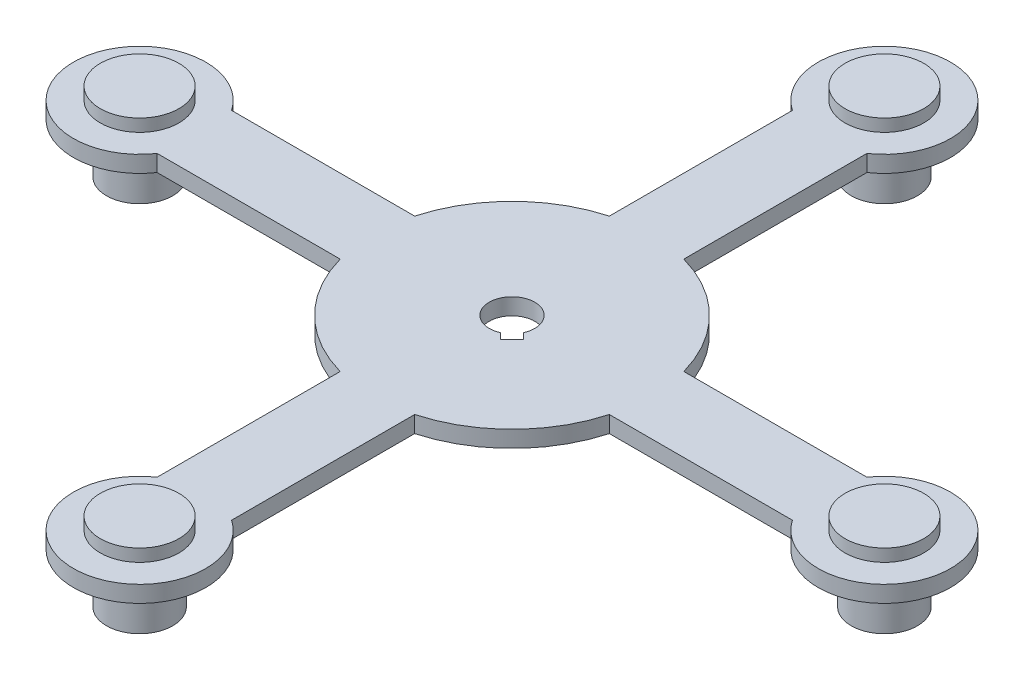
ISO-10303-21;
HEADER;
FILE_DESCRIPTION(('STEP AP214'),'2;1');
FILE_NAME('part.step','',(''),(''),'','','');
FILE_SCHEMA(('AUTOMOTIVE_DESIGN { 1 0 10303 214 1 1 1 1 }'));
ENDSEC;
DATA;
#1=APPLICATION_CONTEXT('core data for automotive mechanical design processes');
#2=APPLICATION_PROTOCOL_DEFINITION('international standard','automotive_design',2000,#1);
#3=PRODUCT_CONTEXT('',#1,'mechanical');
#4=PRODUCT('Part','Part','',(#3));
#5=PRODUCT_RELATED_PRODUCT_CATEGORY('part','',(#4));
#6=PRODUCT_DEFINITION_FORMATION('','',#4);
#7=PRODUCT_DEFINITION_CONTEXT('part definition',#1,'design');
#8=PRODUCT_DEFINITION('design','',#6,#7);
#9=PRODUCT_DEFINITION_SHAPE('','',#8);
#10=(LENGTH_UNIT() NAMED_UNIT(*) SI_UNIT(.MILLI.,.METRE.));
#11=(NAMED_UNIT(*) PLANE_ANGLE_UNIT() SI_UNIT($,.RADIAN.));
#12=(NAMED_UNIT(*) SI_UNIT($,.STERADIAN.) SOLID_ANGLE_UNIT());
#13=UNCERTAINTY_MEASURE_WITH_UNIT(LENGTH_MEASURE(1.E-05),#10,'distance_accuracy_value','');
#14=(GEOMETRIC_REPRESENTATION_CONTEXT(3) GLOBAL_UNCERTAINTY_ASSIGNED_CONTEXT((#13)) GLOBAL_UNIT_ASSIGNED_CONTEXT((#10,
#11,#12)) REPRESENTATION_CONTEXT('',''));
#15=CARTESIAN_POINT('',(0.,0.,0.));
#16=DIRECTION('',(0.,0.,1.));
#17=DIRECTION('',(1.,0.,0.));
#18=AXIS2_PLACEMENT_3D('',#15,#16,#17);
#19=CARTESIAN_POINT('',(-180.,4.,0.));
#20=DIRECTION('',(0.,-1.,0.));
#21=DIRECTION('',(0.,0.,-1.));
#22=AXIS2_PLACEMENT_3D('',#19,#20,#21);
#23=CYLINDRICAL_SURFACE('',#22,32.);
#24=CARTESIAN_POINT('',(-180.,-4.,0.));
#25=DIRECTION('',(0.,1.,0.));
#26=DIRECTION('',(0.,0.,1.));
#27=AXIS2_PLACEMENT_3D('',#24,#25,#26);
#28=CIRCLE('',#27,32.);
#29=CARTESIAN_POINT('',(-153.542486889354,-4.,-18.));
#30=VERTEX_POINT('',#29);
#31=CARTESIAN_POINT('',(-153.542486889354,-4.,18.));
#32=VERTEX_POINT('',#31);
#33=EDGE_CURVE('E249',#30,#32,#28,.T.);
#34=ORIENTED_EDGE('',*,*,#33,.T.);
#35=DIRECTION('',(0.,-1.,0.));
#36=VECTOR('',#35,1.);
#37=CARTESIAN_POINT('',(-153.542486889354,4.,18.));
#38=LINE('',#37,#36);
#39=CARTESIAN_POINT('',(-153.542486889354,4.,18.));
#40=VERTEX_POINT('',#39);
#41=EDGE_CURVE('E41',#40,#32,#38,.T.);
#42=ORIENTED_EDGE('',*,*,#41,.F.);
#43=CARTESIAN_POINT('',(-180.,4.,0.));
#44=DIRECTION('',(0.,1.,0.));
#45=DIRECTION('',(0.,0.,1.));
#46=AXIS2_PLACEMENT_3D('',#43,#44,#45);
#47=CIRCLE('',#46,32.);
#48=CARTESIAN_POINT('',(-153.542486889354,4.,-18.));
#49=VERTEX_POINT('',#48);
#50=EDGE_CURVE('E252',#49,#40,#47,.T.);
#51=ORIENTED_EDGE('',*,*,#50,.F.);
#52=DIRECTION('',(0.,-1.,0.));
#53=VECTOR('',#52,1.);
#54=CARTESIAN_POINT('',(-153.542486889354,4.,-18.));
#55=LINE('',#54,#53);
#56=EDGE_CURVE('E290',#49,#30,#55,.T.);
#57=ORIENTED_EDGE('',*,*,#56,.T.);
#58=EDGE_LOOP('',(#34,#42,#51,#57));
#59=FACE_BOUND('',#58,.T.);
#60=ADVANCED_FACE('F38',(#59),#23,.T.);
#61=CARTESIAN_POINT('',(0.,4.,18.));
#62=DIRECTION('',(0.,0.,-1.));
#63=DIRECTION('',(-1.,0.,0.));
#64=AXIS2_PLACEMENT_3D('',#61,#62,#63);
#65=PLANE('',#64);
#66=DIRECTION('',(1.,0.,0.));
#67=VECTOR('',#66,1.);
#68=CARTESIAN_POINT('',(0.,-4.,18.));
#69=LINE('',#68,#67);
#70=CARTESIAN_POINT('',(-65.0557453266043,-4.,18.));
#71=VERTEX_POINT('',#70);
#72=EDGE_CURVE('E293',#32,#71,#69,.T.);
#73=ORIENTED_EDGE('',*,*,#72,.T.);
#74=DIRECTION('',(0.,-1.,0.));
#75=VECTOR('',#74,1.);
#76=CARTESIAN_POINT('',(-65.0557453266043,4.,18.));
#77=LINE('',#76,#75);
#78=CARTESIAN_POINT('',(-65.0557453266043,4.,18.));
#79=VERTEX_POINT('',#78);
#80=EDGE_CURVE('E362',#79,#71,#77,.T.);
#81=ORIENTED_EDGE('',*,*,#80,.F.);
#82=DIRECTION('',(1.,0.,0.));
#83=VECTOR('',#82,1.);
#84=CARTESIAN_POINT('',(0.,4.,18.));
#85=LINE('',#84,#83);
#86=EDGE_CURVE('E255',#40,#79,#85,.T.);
#87=ORIENTED_EDGE('',*,*,#86,.F.);
#88=ORIENTED_EDGE('',*,*,#41,.T.);
#89=EDGE_LOOP('',(#73,#81,#87,#88));
#90=FACE_BOUND('',#89,.T.);
#91=ADVANCED_FACE('F371',(#90),#65,.F.);
#92=CARTESIAN_POINT('',(0.,4.,0.));
#93=DIRECTION('',(0.,-1.,0.));
#94=DIRECTION('',(0.,0.,-1.));
#95=AXIS2_PLACEMENT_3D('',#92,#93,#94);
#96=CYLINDRICAL_SURFACE('',#95,67.5);
#97=CARTESIAN_POINT('',(0.,-4.,0.));
#98=DIRECTION('',(0.,1.,0.));
#99=DIRECTION('',(0.,0.,1.));
#100=AXIS2_PLACEMENT_3D('',#97,#98,#99);
#101=CIRCLE('',#100,67.5);
#102=CARTESIAN_POINT('',(-18.,-4.,65.0557453266043));
#103=VERTEX_POINT('',#102);
#104=EDGE_CURVE('E295',#71,#103,#101,.T.);
#105=ORIENTED_EDGE('',*,*,#104,.T.);
#106=DIRECTION('',(0.,-1.,0.));
#107=VECTOR('',#106,1.);
#108=CARTESIAN_POINT('',(-18.,4.,65.0557453266043));
#109=LINE('',#108,#107);
#110=CARTESIAN_POINT('',(-18.,4.,65.0557453266043));
#111=VERTEX_POINT('',#110);
#112=EDGE_CURVE('E361',#111,#103,#109,.T.);
#113=ORIENTED_EDGE('',*,*,#112,.F.);
#114=CARTESIAN_POINT('',(0.,4.,0.));
#115=DIRECTION('',(0.,1.,0.));
#116=DIRECTION('',(0.,0.,1.));
#117=AXIS2_PLACEMENT_3D('',#114,#115,#116);
#118=CIRCLE('',#117,67.5);
#119=EDGE_CURVE('E258',#79,#111,#118,.T.);
#120=ORIENTED_EDGE('',*,*,#119,.F.);
#121=ORIENTED_EDGE('',*,*,#80,.T.);
#122=EDGE_LOOP('',(#105,#113,#120,#121));
#123=FACE_BOUND('',#122,.T.);
#124=ADVANCED_FACE('F439',(#123),#96,.T.);
#125=CARTESIAN_POINT('',(-18.,4.,0.));
#126=DIRECTION('',(-1.,0.,0.));
#127=DIRECTION('',(0.,0.,1.));
#128=AXIS2_PLACEMENT_3D('',#125,#126,#127);
#129=PLANE('',#128);
#130=DIRECTION('',(0.,0.,-1.));
#131=VECTOR('',#130,1.);
#132=CARTESIAN_POINT('',(-18.,-4.,0.));
#133=LINE('',#132,#131);
#134=CARTESIAN_POINT('',(-18.,-4.,153.542486889354));
#135=VERTEX_POINT('',#134);
#136=EDGE_CURVE('E298',#135,#103,#133,.T.);
#137=ORIENTED_EDGE('',*,*,#136,.F.);
#138=DIRECTION('',(0.,-1.,0.));
#139=VECTOR('',#138,1.);
#140=CARTESIAN_POINT('',(-18.,4.,153.542486889354));
#141=LINE('',#140,#139);
#142=CARTESIAN_POINT('',(-18.,4.,153.542486889354));
#143=VERTEX_POINT('',#142);
#144=EDGE_CURVE('E359',#143,#135,#141,.T.);
#145=ORIENTED_EDGE('',*,*,#144,.F.);
#146=DIRECTION('',(0.,0.,-1.));
#147=VECTOR('',#146,1.);
#148=CARTESIAN_POINT('',(-18.,4.,0.));
#149=LINE('',#148,#147);
#150=EDGE_CURVE('E260',#143,#111,#149,.T.);
#151=ORIENTED_EDGE('',*,*,#150,.T.);
#152=ORIENTED_EDGE('',*,*,#112,.T.);
#153=EDGE_LOOP('',(#137,#145,#151,#152));
#154=FACE_BOUND('',#153,.T.);
#155=ADVANCED_FACE('F437',(#154),#129,.T.);
#156=CARTESIAN_POINT('',(0.,4.,180.));
#157=DIRECTION('',(0.,-1.,0.));
#158=DIRECTION('',(0.,0.,-1.));
#159=AXIS2_PLACEMENT_3D('',#156,#157,#158);
#160=CYLINDRICAL_SURFACE('',#159,32.);
#161=CARTESIAN_POINT('',(0.,-4.,180.));
#162=DIRECTION('',(0.,1.,0.));
#163=DIRECTION('',(0.,0.,1.));
#164=AXIS2_PLACEMENT_3D('',#161,#162,#163);
#165=CIRCLE('',#164,32.);
#166=CARTESIAN_POINT('',(18.,-4.,153.542486889354));
#167=VERTEX_POINT('',#166);
#168=EDGE_CURVE('E301',#135,#167,#165,.T.);
#169=ORIENTED_EDGE('',*,*,#168,.T.);
#170=DIRECTION('',(0.,-1.,0.));
#171=VECTOR('',#170,1.);
#172=CARTESIAN_POINT('',(18.,4.,153.542486889354));
#173=LINE('',#172,#171);
#174=CARTESIAN_POINT('',(18.,4.,153.542486889354));
#175=VERTEX_POINT('',#174);
#176=EDGE_CURVE('E356',#175,#167,#173,.T.);
#177=ORIENTED_EDGE('',*,*,#176,.F.);
#178=CARTESIAN_POINT('',(0.,4.,180.));
#179=DIRECTION('',(0.,1.,0.));
#180=DIRECTION('',(0.,0.,1.));
#181=AXIS2_PLACEMENT_3D('',#178,#179,#180);
#182=CIRCLE('',#181,32.);
#183=EDGE_CURVE('E263',#143,#175,#182,.T.);
#184=ORIENTED_EDGE('',*,*,#183,.F.);
#185=ORIENTED_EDGE('',*,*,#144,.T.);
#186=EDGE_LOOP('',(#169,#177,#184,#185));
#187=FACE_BOUND('',#186,.T.);
#188=ADVANCED_FACE('F434',(#187),#160,.T.);
#189=CARTESIAN_POINT('',(18.,4.,0.));
#190=DIRECTION('',(-1.,0.,0.));
#191=DIRECTION('',(0.,0.,1.));
#192=AXIS2_PLACEMENT_3D('',#189,#190,#191);
#193=PLANE('',#192);
#194=DIRECTION('',(0.,0.,-1.));
#195=VECTOR('',#194,1.);
#196=CARTESIAN_POINT('',(18.,-4.,0.));
#197=LINE('',#196,#195);
#198=CARTESIAN_POINT('',(18.,-4.,65.0557453266043));
#199=VERTEX_POINT('',#198);
#200=EDGE_CURVE('E303',#167,#199,#197,.T.);
#201=ORIENTED_EDGE('',*,*,#200,.T.);
#202=DIRECTION('',(0.,-1.,0.));
#203=VECTOR('',#202,1.);
#204=CARTESIAN_POINT('',(18.,4.,65.0557453266043));
#205=LINE('',#204,#203);
#206=CARTESIAN_POINT('',(18.,4.,65.0557453266043));
#207=VERTEX_POINT('',#206);
#208=EDGE_CURVE('E353',#207,#199,#205,.T.);
#209=ORIENTED_EDGE('',*,*,#208,.F.);
#210=DIRECTION('',(0.,0.,-1.));
#211=VECTOR('',#210,1.);
#212=CARTESIAN_POINT('',(18.,4.,0.));
#213=LINE('',#212,#211);
#214=EDGE_CURVE('E265',#175,#207,#213,.T.);
#215=ORIENTED_EDGE('',*,*,#214,.F.);
#216=ORIENTED_EDGE('',*,*,#176,.T.);
#217=EDGE_LOOP('',(#201,#209,#215,#216));
#218=FACE_BOUND('',#217,.T.);
#219=ADVANCED_FACE('F429',(#218),#193,.F.);
#220=CARTESIAN_POINT('',(0.,4.,0.));
#221=DIRECTION('',(0.,-1.,0.));
#222=DIRECTION('',(0.,0.,-1.));
#223=AXIS2_PLACEMENT_3D('',#220,#221,#222);
#224=CYLINDRICAL_SURFACE('',#223,67.5);
#225=CARTESIAN_POINT('',(0.,-4.,0.));
#226=DIRECTION('',(0.,1.,0.));
#227=DIRECTION('',(0.,0.,1.));
#228=AXIS2_PLACEMENT_3D('',#225,#226,#227);
#229=CIRCLE('',#228,67.5);
#230=CARTESIAN_POINT('',(65.0557453266044,-4.,18.));
#231=VERTEX_POINT('',#230);
#232=EDGE_CURVE('E305',#199,#231,#229,.T.);
#233=ORIENTED_EDGE('',*,*,#232,.T.);
#234=DIRECTION('',(0.,-1.,0.));
#235=VECTOR('',#234,1.);
#236=CARTESIAN_POINT('',(65.0557453266044,4.,18.));
#237=LINE('',#236,#235);
#238=CARTESIAN_POINT('',(65.0557453266044,4.,18.));
#239=VERTEX_POINT('',#238);
#240=EDGE_CURVE('E350',#239,#231,#237,.T.);
#241=ORIENTED_EDGE('',*,*,#240,.F.);
#242=CARTESIAN_POINT('',(0.,4.,0.));
#243=DIRECTION('',(0.,1.,0.));
#244=DIRECTION('',(0.,0.,1.));
#245=AXIS2_PLACEMENT_3D('',#242,#243,#244);
#246=CIRCLE('',#245,67.5);
#247=EDGE_CURVE('E267',#207,#239,#246,.T.);
#248=ORIENTED_EDGE('',*,*,#247,.F.);
#249=ORIENTED_EDGE('',*,*,#208,.T.);
#250=EDGE_LOOP('',(#233,#241,#248,#249));
#251=FACE_BOUND('',#250,.T.);
#252=ADVANCED_FACE('F423',(#251),#224,.T.);
#253=CARTESIAN_POINT('',(0.,4.,18.));
#254=DIRECTION('',(0.,0.,-1.));
#255=DIRECTION('',(-1.,0.,0.));
#256=AXIS2_PLACEMENT_3D('',#253,#254,#255);
#257=PLANE('',#256);
#258=DIRECTION('',(1.,0.,0.));
#259=VECTOR('',#258,1.);
#260=CARTESIAN_POINT('',(0.,-4.,18.));
#261=LINE('',#260,#259);
#262=CARTESIAN_POINT('',(153.542486889354,-4.,18.));
#263=VERTEX_POINT('',#262);
#264=EDGE_CURVE('E307',#231,#263,#261,.T.);
#265=ORIENTED_EDGE('',*,*,#264,.T.);
#266=DIRECTION('',(0.,-1.,0.));
#267=VECTOR('',#266,1.);
#268=CARTESIAN_POINT('',(153.542486889354,4.,18.));
#269=LINE('',#268,#267);
#270=CARTESIAN_POINT('',(153.542486889354,4.,18.));
#271=VERTEX_POINT('',#270);
#272=EDGE_CURVE('E347',#271,#263,#269,.T.);
#273=ORIENTED_EDGE('',*,*,#272,.F.);
#274=DIRECTION('',(1.,0.,0.));
#275=VECTOR('',#274,1.);
#276=CARTESIAN_POINT('',(0.,4.,18.));
#277=LINE('',#276,#275);
#278=EDGE_CURVE('E269',#239,#271,#277,.T.);
#279=ORIENTED_EDGE('',*,*,#278,.F.);
#280=ORIENTED_EDGE('',*,*,#240,.T.);
#281=EDGE_LOOP('',(#265,#273,#279,#280));
#282=FACE_BOUND('',#281,.T.);
#283=ADVANCED_FACE('F419',(#282),#257,.F.);
#284=CARTESIAN_POINT('',(180.,4.,0.));
#285=DIRECTION('',(0.,-1.,0.));
#286=DIRECTION('',(0.,0.,-1.));
#287=AXIS2_PLACEMENT_3D('',#284,#285,#286);
#288=CYLINDRICAL_SURFACE('',#287,32.);
#289=CARTESIAN_POINT('',(180.,-4.,0.));
#290=DIRECTION('',(0.,1.,0.));
#291=DIRECTION('',(0.,0.,1.));
#292=AXIS2_PLACEMENT_3D('',#289,#290,#291);
#293=CIRCLE('',#292,32.);
#294=CARTESIAN_POINT('',(153.542486889354,-4.,-18.));
#295=VERTEX_POINT('',#294);
#296=EDGE_CURVE('E309',#263,#295,#293,.T.);
#297=ORIENTED_EDGE('',*,*,#296,.T.);
#298=DIRECTION('',(0.,-1.,0.));
#299=VECTOR('',#298,1.);
#300=CARTESIAN_POINT('',(153.542486889354,4.,-18.));
#301=LINE('',#300,#299);
#302=CARTESIAN_POINT('',(153.542486889354,4.,-18.));
#303=VERTEX_POINT('',#302);
#304=EDGE_CURVE('E345',#303,#295,#301,.T.);
#305=ORIENTED_EDGE('',*,*,#304,.F.);
#306=CARTESIAN_POINT('',(180.,4.,0.));
#307=DIRECTION('',(0.,1.,0.));
#308=DIRECTION('',(0.,0.,1.));
#309=AXIS2_PLACEMENT_3D('',#306,#307,#308);
#310=CIRCLE('',#309,32.);
#311=EDGE_CURVE('E271',#271,#303,#310,.T.);
#312=ORIENTED_EDGE('',*,*,#311,.F.);
#313=ORIENTED_EDGE('',*,*,#272,.T.);
#314=EDGE_LOOP('',(#297,#305,#312,#313));
#315=FACE_BOUND('',#314,.T.);
#316=ADVANCED_FACE('F414',(#315),#288,.T.);
#317=CARTESIAN_POINT('',(0.,4.,-18.));
#318=DIRECTION('',(0.,0.,-1.));
#319=DIRECTION('',(-1.,0.,0.));
#320=AXIS2_PLACEMENT_3D('',#317,#318,#319);
#321=PLANE('',#320);
#322=DIRECTION('',(1.,0.,0.));
#323=VECTOR('',#322,1.);
#324=CARTESIAN_POINT('',(0.,-4.,-18.));
#325=LINE('',#324,#323);
#326=CARTESIAN_POINT('',(65.0557453266044,-4.,-18.));
#327=VERTEX_POINT('',#326);
#328=EDGE_CURVE('E312',#327,#295,#325,.T.);
#329=ORIENTED_EDGE('',*,*,#328,.F.);
#330=DIRECTION('',(0.,-1.,0.));
#331=VECTOR('',#330,1.);
#332=CARTESIAN_POINT('',(65.0557453266044,4.,-18.));
#333=LINE('',#332,#331);
#334=CARTESIAN_POINT('',(65.0557453266044,4.,-18.));
#335=VERTEX_POINT('',#334);
#336=EDGE_CURVE('E343',#335,#327,#333,.T.);
#337=ORIENTED_EDGE('',*,*,#336,.F.);
#338=DIRECTION('',(1.,0.,0.));
#339=VECTOR('',#338,1.);
#340=CARTESIAN_POINT('',(0.,4.,-18.));
#341=LINE('',#340,#339);
#342=EDGE_CURVE('E273',#335,#303,#341,.T.);
#343=ORIENTED_EDGE('',*,*,#342,.T.);
#344=ORIENTED_EDGE('',*,*,#304,.T.);
#345=EDGE_LOOP('',(#329,#337,#343,#344));
#346=FACE_BOUND('',#345,.T.);
#347=ADVANCED_FACE('F408',(#346),#321,.T.);
#348=CARTESIAN_POINT('',(0.,4.,0.));
#349=DIRECTION('',(0.,-1.,0.));
#350=DIRECTION('',(0.,0.,-1.));
#351=AXIS2_PLACEMENT_3D('',#348,#349,#350);
#352=CYLINDRICAL_SURFACE('',#351,67.5);
#353=CARTESIAN_POINT('',(0.,-4.,0.));
#354=DIRECTION('',(0.,1.,0.));
#355=DIRECTION('',(0.,0.,1.));
#356=AXIS2_PLACEMENT_3D('',#353,#354,#355);
#357=CIRCLE('',#356,67.5);
#358=CARTESIAN_POINT('',(18.,-4.,-65.0557453266044));
#359=VERTEX_POINT('',#358);
#360=EDGE_CURVE('E315',#327,#359,#357,.T.);
#361=ORIENTED_EDGE('',*,*,#360,.T.);
#362=DIRECTION('',(0.,-1.,0.));
#363=VECTOR('',#362,1.);
#364=CARTESIAN_POINT('',(18.,4.,-65.0557453266044));
#365=LINE('',#364,#363);
#366=CARTESIAN_POINT('',(18.,4.,-65.0557453266044));
#367=VERTEX_POINT('',#366);
#368=EDGE_CURVE('E340',#367,#359,#365,.T.);
#369=ORIENTED_EDGE('',*,*,#368,.F.);
#370=CARTESIAN_POINT('',(0.,4.,0.));
#371=DIRECTION('',(0.,1.,0.));
#372=DIRECTION('',(0.,0.,1.));
#373=AXIS2_PLACEMENT_3D('',#370,#371,#372);
#374=CIRCLE('',#373,67.5);
#375=EDGE_CURVE('E276',#335,#367,#374,.T.);
#376=ORIENTED_EDGE('',*,*,#375,.F.);
#377=ORIENTED_EDGE('',*,*,#336,.T.);
#378=EDGE_LOOP('',(#361,#369,#376,#377));
#379=FACE_BOUND('',#378,.T.);
#380=ADVANCED_FACE('F405',(#379),#352,.T.);
#381=CARTESIAN_POINT('',(18.,4.,0.));
#382=DIRECTION('',(-1.,0.,0.));
#383=DIRECTION('',(0.,0.,1.));
#384=AXIS2_PLACEMENT_3D('',#381,#382,#383);
#385=PLANE('',#384);
#386=DIRECTION('',(0.,0.,-1.));
#387=VECTOR('',#386,1.);
#388=CARTESIAN_POINT('',(18.,-4.,0.));
#389=LINE('',#388,#387);
#390=CARTESIAN_POINT('',(18.,-4.,-153.542486889354));
#391=VERTEX_POINT('',#390);
#392=EDGE_CURVE('E317',#359,#391,#389,.T.);
#393=ORIENTED_EDGE('',*,*,#392,.T.);
#394=DIRECTION('',(0.,-1.,0.));
#395=VECTOR('',#394,1.);
#396=CARTESIAN_POINT('',(18.,4.,-153.542486889354));
#397=LINE('',#396,#395);
#398=CARTESIAN_POINT('',(18.,4.,-153.542486889354));
#399=VERTEX_POINT('',#398);
#400=EDGE_CURVE('E337',#399,#391,#397,.T.);
#401=ORIENTED_EDGE('',*,*,#400,.F.);
#402=DIRECTION('',(0.,0.,-1.));
#403=VECTOR('',#402,1.);
#404=CARTESIAN_POINT('',(18.,4.,0.));
#405=LINE('',#404,#403);
#406=EDGE_CURVE('E278',#367,#399,#405,.T.);
#407=ORIENTED_EDGE('',*,*,#406,.F.);
#408=ORIENTED_EDGE('',*,*,#368,.T.);
#409=EDGE_LOOP('',(#393,#401,#407,#408));
#410=FACE_BOUND('',#409,.T.);
#411=ADVANCED_FACE('F400',(#410),#385,.F.);
#412=CARTESIAN_POINT('',(0.,4.,-180.));
#413=DIRECTION('',(0.,-1.,0.));
#414=DIRECTION('',(0.,0.,-1.));
#415=AXIS2_PLACEMENT_3D('',#412,#413,#414);
#416=CYLINDRICAL_SURFACE('',#415,32.);
#417=CARTESIAN_POINT('',(0.,-4.,-180.));
#418=DIRECTION('',(0.,1.,0.));
#419=DIRECTION('',(0.,0.,1.));
#420=AXIS2_PLACEMENT_3D('',#417,#418,#419);
#421=CIRCLE('',#420,32.);
#422=CARTESIAN_POINT('',(-18.,-4.,-153.542486889354));
#423=VERTEX_POINT('',#422);
#424=EDGE_CURVE('E319',#391,#423,#421,.T.);
#425=ORIENTED_EDGE('',*,*,#424,.T.);
#426=DIRECTION('',(0.,-1.,0.));
#427=VECTOR('',#426,1.);
#428=CARTESIAN_POINT('',(-18.,4.,-153.542486889354));
#429=LINE('',#428,#427);
#430=CARTESIAN_POINT('',(-18.,4.,-153.542486889354));
#431=VERTEX_POINT('',#430);
#432=EDGE_CURVE('E335',#431,#423,#429,.T.);
#433=ORIENTED_EDGE('',*,*,#432,.F.);
#434=CARTESIAN_POINT('',(0.,4.,-180.));
#435=DIRECTION('',(0.,1.,0.));
#436=DIRECTION('',(0.,0.,1.));
#437=AXIS2_PLACEMENT_3D('',#434,#435,#436);
#438=CIRCLE('',#437,32.);
#439=EDGE_CURVE('E280',#399,#431,#438,.T.);
#440=ORIENTED_EDGE('',*,*,#439,.F.);
#441=ORIENTED_EDGE('',*,*,#400,.T.);
#442=EDGE_LOOP('',(#425,#433,#440,#441));
#443=FACE_BOUND('',#442,.T.);
#444=ADVANCED_FACE('F394',(#443),#416,.T.);
#445=CARTESIAN_POINT('',(-18.,4.,0.));
#446=DIRECTION('',(-1.,0.,0.));
#447=DIRECTION('',(0.,0.,1.));
#448=AXIS2_PLACEMENT_3D('',#445,#446,#447);
#449=PLANE('',#448);
#450=DIRECTION('',(0.,0.,-1.));
#451=VECTOR('',#450,1.);
#452=CARTESIAN_POINT('',(-18.,-4.,0.));
#453=LINE('',#452,#451);
#454=CARTESIAN_POINT('',(-18.,-4.,-65.0557453266043));
#455=VERTEX_POINT('',#454);
#456=EDGE_CURVE('E322',#455,#423,#453,.T.);
#457=ORIENTED_EDGE('',*,*,#456,.F.);
#458=DIRECTION('',(0.,-1.,0.));
#459=VECTOR('',#458,1.);
#460=CARTESIAN_POINT('',(-18.,4.,-65.0557453266043));
#461=LINE('',#460,#459);
#462=CARTESIAN_POINT('',(-18.,4.,-65.0557453266043));
#463=VERTEX_POINT('',#462);
#464=EDGE_CURVE('E333',#463,#455,#461,.T.);
#465=ORIENTED_EDGE('',*,*,#464,.F.);
#466=DIRECTION('',(0.,0.,-1.));
#467=VECTOR('',#466,1.);
#468=CARTESIAN_POINT('',(-18.,4.,0.));
#469=LINE('',#468,#467);
#470=EDGE_CURVE('E282',#463,#431,#469,.T.);
#471=ORIENTED_EDGE('',*,*,#470,.T.);
#472=ORIENTED_EDGE('',*,*,#432,.T.);
#473=EDGE_LOOP('',(#457,#465,#471,#472));
#474=FACE_BOUND('',#473,.T.);
#475=ADVANCED_FACE('F389',(#474),#449,.T.);
#476=CARTESIAN_POINT('',(0.,4.,0.));
#477=DIRECTION('',(0.,-1.,0.));
#478=DIRECTION('',(0.,0.,-1.));
#479=AXIS2_PLACEMENT_3D('',#476,#477,#478);
#480=CYLINDRICAL_SURFACE('',#479,67.5);
#481=CARTESIAN_POINT('',(0.,-4.,0.));
#482=DIRECTION('',(0.,1.,0.));
#483=DIRECTION('',(0.,0.,1.));
#484=AXIS2_PLACEMENT_3D('',#481,#482,#483);
#485=CIRCLE('',#484,67.5);
#486=CARTESIAN_POINT('',(-65.0557453266043,-4.,-18.));
#487=VERTEX_POINT('',#486);
#488=EDGE_CURVE('E325',#455,#487,#485,.T.);
#489=ORIENTED_EDGE('',*,*,#488,.T.);
#490=DIRECTION('',(0.,-1.,0.));
#491=VECTOR('',#490,1.);
#492=CARTESIAN_POINT('',(-65.0557453266043,4.,-18.));
#493=LINE('',#492,#491);
#494=CARTESIAN_POINT('',(-65.0557453266043,4.,-18.));
#495=VERTEX_POINT('',#494);
#496=EDGE_CURVE('E331',#495,#487,#493,.T.);
#497=ORIENTED_EDGE('',*,*,#496,.F.);
#498=CARTESIAN_POINT('',(0.,4.,0.));
#499=DIRECTION('',(0.,1.,0.));
#500=DIRECTION('',(0.,0.,1.));
#501=AXIS2_PLACEMENT_3D('',#498,#499,#500);
#502=CIRCLE('',#501,67.5);
#503=EDGE_CURVE('E285',#463,#495,#502,.T.);
#504=ORIENTED_EDGE('',*,*,#503,.F.);
#505=ORIENTED_EDGE('',*,*,#464,.T.);
#506=EDGE_LOOP('',(#489,#497,#504,#505));
#507=FACE_BOUND('',#506,.T.);
#508=ADVANCED_FACE('F385',(#507),#480,.T.);
#509=CARTESIAN_POINT('',(0.,4.,-18.));
#510=DIRECTION('',(0.,0.,-1.));
#511=DIRECTION('',(-1.,0.,0.));
#512=AXIS2_PLACEMENT_3D('',#509,#510,#511);
#513=PLANE('',#512);
#514=DIRECTION('',(1.,0.,0.));
#515=VECTOR('',#514,1.);
#516=CARTESIAN_POINT('',(0.,-4.,-18.));
#517=LINE('',#516,#515);
#518=EDGE_CURVE('E256',#30,#487,#517,.T.);
#519=ORIENTED_EDGE('',*,*,#518,.F.);
#520=ORIENTED_EDGE('',*,*,#56,.F.);
#521=DIRECTION('',(1.,0.,0.));
#522=VECTOR('',#521,1.);
#523=CARTESIAN_POINT('',(0.,4.,-18.));
#524=LINE('',#523,#522);
#525=EDGE_CURVE('E287',#49,#495,#524,.T.);
#526=ORIENTED_EDGE('',*,*,#525,.T.);
#527=ORIENTED_EDGE('',*,*,#496,.T.);
#528=EDGE_LOOP('',(#519,#520,#526,#527));
#529=FACE_BOUND('',#528,.T.);
#530=ADVANCED_FACE('F380',(#529),#513,.T.);
#531=CARTESIAN_POINT('',(0.,4.,0.));
#532=DIRECTION('',(0.,1.,0.));
#533=DIRECTION('',(0.,0.,1.));
#534=AXIS2_PLACEMENT_3D('',#531,#532,#533);
#535=PLANE('',#534);
#536=CARTESIAN_POINT('',(0.,4.,0.));
#537=DIRECTION('',(0.,1.,0.));
#538=DIRECTION('',(0.,0.,1.));
#539=AXIS2_PLACEMENT_3D('',#536,#537,#538);
#540=CIRCLE('',#539,11.);
#541=CARTESIAN_POINT('',(10.0741154978409,4.,4.41726124834851));
#542=VERTEX_POINT('',#541);
#543=CARTESIAN_POINT('',(4.41726124834855,4.,10.0741154978409));
#544=VERTEX_POINT('',#543);
#545=EDGE_CURVE('E53',#542,#544,#540,.T.);
#546=ORIENTED_EDGE('',*,*,#545,.F.);
#547=DIRECTION('',(0.707106781186549,0.,0.707106781186546));
#548=VECTOR('',#547,1.);
#549=CARTESIAN_POINT('',(2.82842712474619,4.,-2.8284271247462));
#550=LINE('',#549,#548);
#551=CARTESIAN_POINT('',(12.9400540957138,4.,7.28319984622142));
#552=VERTEX_POINT('',#551);
#553=EDGE_CURVE('E194',#542,#552,#550,.T.);
#554=ORIENTED_EDGE('',*,*,#553,.T.);
#555=DIRECTION('',(0.707106781186546,0.,-0.707106781186549));
#556=VECTOR('',#555,1.);
#557=CARTESIAN_POINT('',(10.1116269709677,4.,10.1116269709676));
#558=LINE('',#557,#556);
#559=CARTESIAN_POINT('',(7.28319984622146,4.,12.9400540957138));
#560=VERTEX_POINT('',#559);
#561=EDGE_CURVE('E178',#560,#552,#558,.T.);
#562=ORIENTED_EDGE('',*,*,#561,.F.);
#563=DIRECTION('',(0.707106781186549,0.,0.707106781186547));
#564=VECTOR('',#563,1.);
#565=CARTESIAN_POINT('',(-2.82842712474618,4.,2.82842712474619));
#566=LINE('',#565,#564);
#567=EDGE_CURVE('E187',#544,#560,#566,.T.);
#568=ORIENTED_EDGE('',*,*,#567,.F.);
#569=EDGE_LOOP('',(#546,#554,#562,#568));
#570=FACE_BOUND('',#569,.T.);
#571=CARTESIAN_POINT('',(0.,4.,180.));
#572=DIRECTION('',(0.,1.,0.));
#573=DIRECTION('',(0.,0.,1.));
#574=AXIS2_PLACEMENT_3D('',#571,#572,#573);
#575=CIRCLE('',#574,19.);
#576=CARTESIAN_POINT('',(0.,4.,199.));
#577=VERTEX_POINT('',#576);
#578=EDGE_CURVE('E205',#577,#577,#575,.T.);
#579=ORIENTED_EDGE('',*,*,#578,.F.);
#580=EDGE_LOOP('',(#579));
#581=FACE_BOUND('',#580,.T.);
#582=CARTESIAN_POINT('',(180.,4.,0.));
#583=DIRECTION('',(0.,1.,0.));
#584=DIRECTION('',(0.,0.,1.));
#585=AXIS2_PLACEMENT_3D('',#582,#583,#584);
#586=CIRCLE('',#585,19.);
#587=CARTESIAN_POINT('',(180.,4.,19.));
#588=VERTEX_POINT('',#587);
#589=EDGE_CURVE('E210',#588,#588,#586,.T.);
#590=ORIENTED_EDGE('',*,*,#589,.F.);
#591=EDGE_LOOP('',(#590));
#592=FACE_BOUND('',#591,.T.);
#593=CARTESIAN_POINT('',(0.,4.,-180.));
#594=DIRECTION('',(0.,1.,0.));
#595=DIRECTION('',(0.,0.,1.));
#596=AXIS2_PLACEMENT_3D('',#593,#594,#595);
#597=CIRCLE('',#596,19.);
#598=CARTESIAN_POINT('',(0.,4.,-161.));
#599=VERTEX_POINT('',#598);
#600=EDGE_CURVE('E216',#599,#599,#597,.T.);
#601=ORIENTED_EDGE('',*,*,#600,.F.);
#602=EDGE_LOOP('',(#601));
#603=FACE_BOUND('',#602,.T.);
#604=CARTESIAN_POINT('',(-180.,4.,0.));
#605=DIRECTION('',(0.,1.,0.));
#606=DIRECTION('',(0.,0.,1.));
#607=AXIS2_PLACEMENT_3D('',#604,#605,#606);
#608=CIRCLE('',#607,19.);
#609=CARTESIAN_POINT('',(-180.,4.,19.));
#610=VERTEX_POINT('',#609);
#611=EDGE_CURVE('E11',#610,#610,#608,.T.);
#612=ORIENTED_EDGE('',*,*,#611,.F.);
#613=EDGE_LOOP('',(#612));
#614=FACE_BOUND('',#613,.T.);
#615=ORIENTED_EDGE('',*,*,#50,.T.);
#616=ORIENTED_EDGE('',*,*,#86,.T.);
#617=ORIENTED_EDGE('',*,*,#119,.T.);
#618=ORIENTED_EDGE('',*,*,#150,.F.);
#619=ORIENTED_EDGE('',*,*,#183,.T.);
#620=ORIENTED_EDGE('',*,*,#214,.T.);
#621=ORIENTED_EDGE('',*,*,#247,.T.);
#622=ORIENTED_EDGE('',*,*,#278,.T.);
#623=ORIENTED_EDGE('',*,*,#311,.T.);
#624=ORIENTED_EDGE('',*,*,#342,.F.);
#625=ORIENTED_EDGE('',*,*,#375,.T.);
#626=ORIENTED_EDGE('',*,*,#406,.T.);
#627=ORIENTED_EDGE('',*,*,#439,.T.);
#628=ORIENTED_EDGE('',*,*,#470,.F.);
#629=ORIENTED_EDGE('',*,*,#503,.T.);
#630=ORIENTED_EDGE('',*,*,#525,.F.);
#631=EDGE_LOOP('',(#615,#616,#617,#618,#619,#620,#621,#622,#623,#624,#625,#626,#627,#628,#629,#630));
#632=FACE_BOUND('',#631,.T.);
#633=ADVANCED_FACE('F191',(#570,#581,#592,#603,#614,#632),#535,.T.);
#634=CARTESIAN_POINT('',(0.,-4.,0.));
#635=DIRECTION('',(0.,1.,0.));
#636=DIRECTION('',(0.,0.,1.));
#637=AXIS2_PLACEMENT_3D('',#634,#635,#636);
#638=PLANE('',#637);
#639=DIRECTION('',(-0.707106781186549,0.,-0.707106781186546));
#640=VECTOR('',#639,1.);
#641=CARTESIAN_POINT('',(2.82842712474619,-4.,-2.8284271247462));
#642=LINE('',#641,#640);
#643=CARTESIAN_POINT('',(12.9400540957138,-4.,7.28319984622142));
#644=VERTEX_POINT('',#643);
#645=CARTESIAN_POINT('',(10.0741154978409,-4.,4.41726124834851));
#646=VERTEX_POINT('',#645);
#647=EDGE_CURVE('E705',#644,#646,#642,.T.);
#648=ORIENTED_EDGE('',*,*,#647,.T.);
#649=CARTESIAN_POINT('',(0.,-4.,0.));
#650=DIRECTION('',(0.,1.,0.));
#651=DIRECTION('',(0.,0.,1.));
#652=AXIS2_PLACEMENT_3D('',#649,#650,#651);
#653=CIRCLE('',#652,11.);
#654=CARTESIAN_POINT('',(4.41726124834855,-4.,10.0741154978409));
#655=VERTEX_POINT('',#654);
#656=EDGE_CURVE('E206',#655,#646,#653,.F.);
#657=ORIENTED_EDGE('',*,*,#656,.F.);
#658=DIRECTION('',(-0.707106781186549,0.,-0.707106781186547));
#659=VECTOR('',#658,1.);
#660=CARTESIAN_POINT('',(-2.82842712474618,-4.,2.82842712474619));
#661=LINE('',#660,#659);
#662=CARTESIAN_POINT('',(7.28319984622146,-4.,12.9400540957138));
#663=VERTEX_POINT('',#662);
#664=EDGE_CURVE('E203',#663,#655,#661,.T.);
#665=ORIENTED_EDGE('',*,*,#664,.F.);
#666=DIRECTION('',(-0.707106781186546,0.,0.707106781186549));
#667=VECTOR('',#666,1.);
#668=CARTESIAN_POINT('',(10.1116269709677,-4.,10.1116269709676));
#669=LINE('',#668,#667);
#670=EDGE_CURVE('E181',#644,#663,#669,.T.);
#671=ORIENTED_EDGE('',*,*,#670,.F.);
#672=EDGE_LOOP('',(#648,#657,#665,#671));
#673=FACE_BOUND('',#672,.T.);
#674=CARTESIAN_POINT('',(0.,-4.,-180.));
#675=DIRECTION('',(0.,1.,0.));
#676=DIRECTION('',(0.,0.,1.));
#677=AXIS2_PLACEMENT_3D('',#674,#675,#676);
#678=CIRCLE('',#677,16.);
#679=CARTESIAN_POINT('',(0.,-4.,-164.));
#680=VERTEX_POINT('',#679);
#681=EDGE_CURVE('E226',#680,#680,#678,.T.);
#682=ORIENTED_EDGE('',*,*,#681,.T.);
#683=EDGE_LOOP('',(#682));
#684=FACE_BOUND('',#683,.T.);
#685=CARTESIAN_POINT('',(180.,-4.,0.));
#686=DIRECTION('',(0.,1.,0.));
#687=DIRECTION('',(0.,0.,1.));
#688=AXIS2_PLACEMENT_3D('',#685,#686,#687);
#689=CIRCLE('',#688,16.);
#690=CARTESIAN_POINT('',(180.,-4.,16.));
#691=VERTEX_POINT('',#690);
#692=EDGE_CURVE('E231',#691,#691,#689,.T.);
#693=ORIENTED_EDGE('',*,*,#692,.T.);
#694=EDGE_LOOP('',(#693));
#695=FACE_BOUND('',#694,.T.);
#696=CARTESIAN_POINT('',(0.,-4.,180.));
#697=DIRECTION('',(0.,1.,0.));
#698=DIRECTION('',(0.,0.,1.));
#699=AXIS2_PLACEMENT_3D('',#696,#697,#698);
#700=CIRCLE('',#699,16.);
#701=CARTESIAN_POINT('',(0.,-4.,196.));
#702=VERTEX_POINT('',#701);
#703=EDGE_CURVE('E237',#702,#702,#700,.T.);
#704=ORIENTED_EDGE('',*,*,#703,.T.);
#705=EDGE_LOOP('',(#704));
#706=FACE_BOUND('',#705,.T.);
#707=CARTESIAN_POINT('',(-180.,-4.,0.));
#708=DIRECTION('',(0.,1.,0.));
#709=DIRECTION('',(0.,0.,1.));
#710=AXIS2_PLACEMENT_3D('',#707,#708,#709);
#711=CIRCLE('',#710,16.);
#712=CARTESIAN_POINT('',(-180.,-4.,16.));
#713=VERTEX_POINT('',#712);
#714=EDGE_CURVE('E243',#713,#713,#711,.T.);
#715=ORIENTED_EDGE('',*,*,#714,.T.);
#716=EDGE_LOOP('',(#715));
#717=FACE_BOUND('',#716,.T.);
#718=ORIENTED_EDGE('',*,*,#33,.F.);
#719=ORIENTED_EDGE('',*,*,#518,.T.);
#720=ORIENTED_EDGE('',*,*,#488,.F.);
#721=ORIENTED_EDGE('',*,*,#456,.T.);
#722=ORIENTED_EDGE('',*,*,#424,.F.);
#723=ORIENTED_EDGE('',*,*,#392,.F.);
#724=ORIENTED_EDGE('',*,*,#360,.F.);
#725=ORIENTED_EDGE('',*,*,#328,.T.);
#726=ORIENTED_EDGE('',*,*,#296,.F.);
#727=ORIENTED_EDGE('',*,*,#264,.F.);
#728=ORIENTED_EDGE('',*,*,#232,.F.);
#729=ORIENTED_EDGE('',*,*,#200,.F.);
#730=ORIENTED_EDGE('',*,*,#168,.F.);
#731=ORIENTED_EDGE('',*,*,#136,.T.);
#732=ORIENTED_EDGE('',*,*,#104,.F.);
#733=ORIENTED_EDGE('',*,*,#72,.F.);
#734=EDGE_LOOP('',(#718,#719,#720,#721,#722,#723,#724,#725,#726,#727,#728,#729,#730,#731,#732,#733));
#735=FACE_BOUND('',#734,.T.);
#736=ADVANCED_FACE('F377',(#673,#684,#695,#706,#717,#735),#638,.F.);
#737=CARTESIAN_POINT('',(-180.,-28.,0.));
#738=DIRECTION('',(0.,1.,0.));
#739=DIRECTION('',(0.,0.,1.));
#740=AXIS2_PLACEMENT_3D('',#737,#738,#739);
#741=CYLINDRICAL_SURFACE('',#740,16.);
#742=CARTESIAN_POINT('',(-180.,-28.,0.));
#743=DIRECTION('',(0.,1.,0.));
#744=DIRECTION('',(0.,0.,1.));
#745=AXIS2_PLACEMENT_3D('',#742,#743,#744);
#746=CIRCLE('',#745,16.);
#747=CARTESIAN_POINT('',(-180.,-28.,16.));
#748=VERTEX_POINT('',#747);
#749=EDGE_CURVE('E246',#748,#748,#746,.T.);
#750=ORIENTED_EDGE('',*,*,#749,.T.);
#751=EDGE_LOOP('',(#750));
#752=FACE_BOUND('',#751,.T.);
#753=ORIENTED_EDGE('',*,*,#714,.F.);
#754=EDGE_LOOP('',(#753));
#755=FACE_BOUND('',#754,.T.);
#756=ADVANCED_FACE('F447',(#752,#755),#741,.T.);
#757=CARTESIAN_POINT('',(-180.,-28.,0.));
#758=DIRECTION('',(0.,1.,0.));
#759=DIRECTION('',(0.,0.,1.));
#760=AXIS2_PLACEMENT_3D('',#757,#758,#759);
#761=PLANE('',#760);
#762=ORIENTED_EDGE('',*,*,#749,.F.);
#763=EDGE_LOOP('',(#762));
#764=FACE_BOUND('',#763,.T.);
#765=ADVANCED_FACE('F502',(#764),#761,.F.);
#766=CARTESIAN_POINT('',(0.,-28.,180.));
#767=DIRECTION('',(0.,1.,0.));
#768=DIRECTION('',(0.,0.,1.));
#769=AXIS2_PLACEMENT_3D('',#766,#767,#768);
#770=CYLINDRICAL_SURFACE('',#769,16.);
#771=CARTESIAN_POINT('',(0.,-28.,180.));
#772=DIRECTION('',(0.,1.,0.));
#773=DIRECTION('',(0.,0.,1.));
#774=AXIS2_PLACEMENT_3D('',#771,#772,#773);
#775=CIRCLE('',#774,16.);
#776=CARTESIAN_POINT('',(0.,-28.,196.));
#777=VERTEX_POINT('',#776);
#778=EDGE_CURVE('E240',#777,#777,#775,.T.);
#779=ORIENTED_EDGE('',*,*,#778,.T.);
#780=EDGE_LOOP('',(#779));
#781=FACE_BOUND('',#780,.T.);
#782=ORIENTED_EDGE('',*,*,#703,.F.);
#783=EDGE_LOOP('',(#782));
#784=FACE_BOUND('',#783,.T.);
#785=ADVANCED_FACE('F512',(#781,#784),#770,.T.);
#786=CARTESIAN_POINT('',(0.,-28.,180.));
#787=DIRECTION('',(0.,1.,0.));
#788=DIRECTION('',(0.,0.,1.));
#789=AXIS2_PLACEMENT_3D('',#786,#787,#788);
#790=PLANE('',#789);
#791=ORIENTED_EDGE('',*,*,#778,.F.);
#792=EDGE_LOOP('',(#791));
#793=FACE_BOUND('',#792,.T.);
#794=ADVANCED_FACE('F522',(#793),#790,.F.);
#795=CARTESIAN_POINT('',(180.,-28.,0.));
#796=DIRECTION('',(0.,1.,0.));
#797=DIRECTION('',(0.,0.,1.));
#798=AXIS2_PLACEMENT_3D('',#795,#796,#797);
#799=CYLINDRICAL_SURFACE('',#798,16.);
#800=CARTESIAN_POINT('',(180.,-28.,0.));
#801=DIRECTION('',(0.,1.,0.));
#802=DIRECTION('',(0.,0.,1.));
#803=AXIS2_PLACEMENT_3D('',#800,#801,#802);
#804=CIRCLE('',#803,16.);
#805=CARTESIAN_POINT('',(180.,-28.,16.));
#806=VERTEX_POINT('',#805);
#807=EDGE_CURVE('E234',#806,#806,#804,.T.);
#808=ORIENTED_EDGE('',*,*,#807,.T.);
#809=EDGE_LOOP('',(#808));
#810=FACE_BOUND('',#809,.T.);
#811=ORIENTED_EDGE('',*,*,#692,.F.);
#812=EDGE_LOOP('',(#811));
#813=FACE_BOUND('',#812,.T.);
#814=ADVANCED_FACE('F532',(#810,#813),#799,.T.);
#815=CARTESIAN_POINT('',(180.,-28.,0.));
#816=DIRECTION('',(0.,1.,0.));
#817=DIRECTION('',(0.,0.,1.));
#818=AXIS2_PLACEMENT_3D('',#815,#816,#817);
#819=PLANE('',#818);
#820=ORIENTED_EDGE('',*,*,#807,.F.);
#821=EDGE_LOOP('',(#820));
#822=FACE_BOUND('',#821,.T.);
#823=ADVANCED_FACE('F542',(#822),#819,.F.);
#824=CARTESIAN_POINT('',(0.,-28.,-180.));
#825=DIRECTION('',(0.,1.,0.));
#826=DIRECTION('',(0.,0.,1.));
#827=AXIS2_PLACEMENT_3D('',#824,#825,#826);
#828=CYLINDRICAL_SURFACE('',#827,16.);
#829=CARTESIAN_POINT('',(0.,-28.,-180.));
#830=DIRECTION('',(0.,1.,0.));
#831=DIRECTION('',(0.,0.,1.));
#832=AXIS2_PLACEMENT_3D('',#829,#830,#831);
#833=CIRCLE('',#832,16.);
#834=CARTESIAN_POINT('',(0.,-28.,-164.));
#835=VERTEX_POINT('',#834);
#836=EDGE_CURVE('E228',#835,#835,#833,.T.);
#837=ORIENTED_EDGE('',*,*,#836,.T.);
#838=EDGE_LOOP('',(#837));
#839=FACE_BOUND('',#838,.T.);
#840=ORIENTED_EDGE('',*,*,#681,.F.);
#841=EDGE_LOOP('',(#840));
#842=FACE_BOUND('',#841,.T.);
#843=ADVANCED_FACE('F552',(#839,#842),#828,.T.);
#844=CARTESIAN_POINT('',(0.,-28.,-180.));
#845=DIRECTION('',(0.,1.,0.));
#846=DIRECTION('',(0.,0.,1.));
#847=AXIS2_PLACEMENT_3D('',#844,#845,#846);
#848=PLANE('',#847);
#849=ORIENTED_EDGE('',*,*,#836,.F.);
#850=EDGE_LOOP('',(#849));
#851=FACE_BOUND('',#850,.T.);
#852=ADVANCED_FACE('F562',(#851),#848,.F.);
#853=CARTESIAN_POINT('',(-180.,10.,0.));
#854=DIRECTION('',(0.,-1.,0.));
#855=DIRECTION('',(0.,0.,-1.));
#856=AXIS2_PLACEMENT_3D('',#853,#854,#855);
#857=CYLINDRICAL_SURFACE('',#856,19.);
#858=CARTESIAN_POINT('',(-180.,10.,0.));
#859=DIRECTION('',(0.,1.,0.));
#860=DIRECTION('',(0.,0.,1.));
#861=AXIS2_PLACEMENT_3D('',#858,#859,#860);
#862=CIRCLE('',#861,19.);
#863=CARTESIAN_POINT('',(-180.,10.,19.));
#864=VERTEX_POINT('',#863);
#865=EDGE_CURVE('E222',#864,#864,#862,.T.);
#866=ORIENTED_EDGE('',*,*,#865,.F.);
#867=EDGE_LOOP('',(#866));
#868=FACE_BOUND('',#867,.T.);
#869=ORIENTED_EDGE('',*,*,#611,.T.);
#870=EDGE_LOOP('',(#869));
#871=FACE_BOUND('',#870,.T.);
#872=ADVANCED_FACE('F572',(#868,#871),#857,.T.);
#873=CARTESIAN_POINT('',(-180.,10.,0.));
#874=DIRECTION('',(0.,1.,0.));
#875=DIRECTION('',(0.,0.,1.));
#876=AXIS2_PLACEMENT_3D('',#873,#874,#875);
#877=PLANE('',#876);
#878=ORIENTED_EDGE('',*,*,#865,.T.);
#879=EDGE_LOOP('',(#878));
#880=FACE_BOUND('',#879,.T.);
#881=ADVANCED_FACE('F582',(#880),#877,.T.);
#882=CARTESIAN_POINT('',(0.,10.,-180.));
#883=DIRECTION('',(0.,-1.,0.));
#884=DIRECTION('',(0.,0.,-1.));
#885=AXIS2_PLACEMENT_3D('',#882,#883,#884);
#886=CYLINDRICAL_SURFACE('',#885,19.);
#887=CARTESIAN_POINT('',(0.,10.,-180.));
#888=DIRECTION('',(0.,1.,0.));
#889=DIRECTION('',(0.,0.,1.));
#890=AXIS2_PLACEMENT_3D('',#887,#888,#889);
#891=CIRCLE('',#890,19.);
#892=CARTESIAN_POINT('',(0.,10.,-161.));
#893=VERTEX_POINT('',#892);
#894=EDGE_CURVE('E219',#893,#893,#891,.T.);
#895=ORIENTED_EDGE('',*,*,#894,.F.);
#896=EDGE_LOOP('',(#895));
#897=FACE_BOUND('',#896,.T.);
#898=ORIENTED_EDGE('',*,*,#600,.T.);
#899=EDGE_LOOP('',(#898));
#900=FACE_BOUND('',#899,.T.);
#901=ADVANCED_FACE('F592',(#897,#900),#886,.T.);
#902=CARTESIAN_POINT('',(0.,10.,-180.));
#903=DIRECTION('',(0.,1.,0.));
#904=DIRECTION('',(0.,0.,1.));
#905=AXIS2_PLACEMENT_3D('',#902,#903,#904);
#906=PLANE('',#905);
#907=ORIENTED_EDGE('',*,*,#894,.T.);
#908=EDGE_LOOP('',(#907));
#909=FACE_BOUND('',#908,.T.);
#910=ADVANCED_FACE('F602',(#909),#906,.T.);
#911=CARTESIAN_POINT('',(180.,10.,0.));
#912=DIRECTION('',(0.,-1.,0.));
#913=DIRECTION('',(0.,0.,-1.));
#914=AXIS2_PLACEMENT_3D('',#911,#912,#913);
#915=CYLINDRICAL_SURFACE('',#914,19.);
#916=CARTESIAN_POINT('',(180.,10.,0.));
#917=DIRECTION('',(0.,1.,0.));
#918=DIRECTION('',(0.,0.,1.));
#919=AXIS2_PLACEMENT_3D('',#916,#917,#918);
#920=CIRCLE('',#919,19.);
#921=CARTESIAN_POINT('',(180.,10.,19.));
#922=VERTEX_POINT('',#921);
#923=EDGE_CURVE('E213',#922,#922,#920,.T.);
#924=ORIENTED_EDGE('',*,*,#923,.F.);
#925=EDGE_LOOP('',(#924));
#926=FACE_BOUND('',#925,.T.);
#927=ORIENTED_EDGE('',*,*,#589,.T.);
#928=EDGE_LOOP('',(#927));
#929=FACE_BOUND('',#928,.T.);
#930=ADVANCED_FACE('F612',(#926,#929),#915,.T.);
#931=CARTESIAN_POINT('',(180.,10.,0.));
#932=DIRECTION('',(0.,1.,0.));
#933=DIRECTION('',(0.,0.,1.));
#934=AXIS2_PLACEMENT_3D('',#931,#932,#933);
#935=PLANE('',#934);
#936=ORIENTED_EDGE('',*,*,#923,.T.);
#937=EDGE_LOOP('',(#936));
#938=FACE_BOUND('',#937,.T.);
#939=ADVANCED_FACE('F622',(#938),#935,.T.);
#940=CARTESIAN_POINT('',(0.,10.,180.));
#941=DIRECTION('',(0.,-1.,0.));
#942=DIRECTION('',(0.,0.,-1.));
#943=AXIS2_PLACEMENT_3D('',#940,#941,#942);
#944=CYLINDRICAL_SURFACE('',#943,19.);
#945=CARTESIAN_POINT('',(0.,10.,180.));
#946=DIRECTION('',(0.,1.,0.));
#947=DIRECTION('',(0.,0.,1.));
#948=AXIS2_PLACEMENT_3D('',#945,#946,#947);
#949=CIRCLE('',#948,19.);
#950=CARTESIAN_POINT('',(0.,10.,199.));
#951=VERTEX_POINT('',#950);
#952=EDGE_CURVE('E207',#951,#951,#949,.T.);
#953=ORIENTED_EDGE('',*,*,#952,.F.);
#954=EDGE_LOOP('',(#953));
#955=FACE_BOUND('',#954,.T.);
#956=ORIENTED_EDGE('',*,*,#578,.T.);
#957=EDGE_LOOP('',(#956));
#958=FACE_BOUND('',#957,.T.);
#959=ADVANCED_FACE('F632',(#955,#958),#944,.T.);
#960=CARTESIAN_POINT('',(0.,10.,180.));
#961=DIRECTION('',(0.,1.,0.));
#962=DIRECTION('',(0.,0.,1.));
#963=AXIS2_PLACEMENT_3D('',#960,#961,#962);
#964=PLANE('',#963);
#965=ORIENTED_EDGE('',*,*,#952,.T.);
#966=EDGE_LOOP('',(#965));
#967=FACE_BOUND('',#966,.T.);
#968=ADVANCED_FACE('F642',(#967),#964,.T.);
#969=CARTESIAN_POINT('',(0.,-37.856349186104,0.));
#970=DIRECTION('',(0.,1.,0.));
#971=DIRECTION('',(0.,0.,1.));
#972=AXIS2_PLACEMENT_3D('',#969,#970,#971);
#973=CYLINDRICAL_SURFACE('',#972,11.);
#974=ORIENTED_EDGE('',*,*,#656,.T.);
#975=DIRECTION('',(0.,1.,0.));
#976=VECTOR('',#975,1.);
#977=CARTESIAN_POINT('',(10.0741154978409,-37.856349186104,4.41726124834851));
#978=LINE('',#977,#976);
#979=EDGE_CURVE('E199',#646,#542,#978,.T.);
#980=ORIENTED_EDGE('',*,*,#979,.T.);
#981=ORIENTED_EDGE('',*,*,#545,.T.);
#982=DIRECTION('',(0.,1.,0.));
#983=VECTOR('',#982,1.);
#984=CARTESIAN_POINT('',(4.41726124834855,-37.856349186104,10.0741154978409));
#985=LINE('',#984,#983);
#986=EDGE_CURVE('E184',#655,#544,#985,.T.);
#987=ORIENTED_EDGE('',*,*,#986,.F.);
#988=EDGE_LOOP('',(#974,#980,#981,#987));
#989=FACE_BOUND('',#988,.T.);
#990=ADVANCED_FACE('F651',(#989),#973,.F.);
#991=CARTESIAN_POINT('',(2.82842712474619,-37.856349186104,-2.8284271247462));
#992=DIRECTION('',(-0.707106781186546,0.,0.707106781186549));
#993=DIRECTION('',(0.707106781186549,0.,0.707106781186546));
#994=AXIS2_PLACEMENT_3D('',#991,#992,#993);
#995=PLANE('',#994);
#996=DIRECTION('',(0.,1.,0.));
#997=VECTOR('',#996,1.);
#998=CARTESIAN_POINT('',(12.9400540957138,-37.856349186104,7.28319984622142));
#999=LINE('',#998,#997);
#1000=EDGE_CURVE('E183',#644,#552,#999,.T.);
#1001=ORIENTED_EDGE('',*,*,#1000,.T.);
#1002=ORIENTED_EDGE('',*,*,#553,.F.);
#1003=ORIENTED_EDGE('',*,*,#979,.F.);
#1004=ORIENTED_EDGE('',*,*,#647,.F.);
#1005=EDGE_LOOP('',(#1001,#1002,#1003,#1004));
#1006=FACE_BOUND('',#1005,.T.);
#1007=ADVANCED_FACE('F674',(#1006),#995,.T.);
#1008=CARTESIAN_POINT('',(10.1116269709677,-37.856349186104,10.1116269709676));
#1009=DIRECTION('',(0.707106781186549,0.,0.707106781186546));
#1010=DIRECTION('',(0.707106781186546,0.,-0.707106781186549));
#1011=AXIS2_PLACEMENT_3D('',#1008,#1009,#1010);
#1012=PLANE('',#1011);
#1013=ORIENTED_EDGE('',*,*,#670,.T.);
#1014=DIRECTION('',(0.,1.,0.));
#1015=VECTOR('',#1014,1.);
#1016=CARTESIAN_POINT('',(7.28319984622146,-37.856349186104,12.9400540957138));
#1017=LINE('',#1016,#1015);
#1018=EDGE_CURVE('E61',#663,#560,#1017,.T.);
#1019=ORIENTED_EDGE('',*,*,#1018,.T.);
#1020=ORIENTED_EDGE('',*,*,#561,.T.);
#1021=ORIENTED_EDGE('',*,*,#1000,.F.);
#1022=EDGE_LOOP('',(#1013,#1019,#1020,#1021));
#1023=FACE_BOUND('',#1022,.T.);
#1024=ADVANCED_FACE('F175',(#1023),#1012,.F.);
#1025=CARTESIAN_POINT('',(-2.82842712474618,-37.856349186104,2.82842712474619));
#1026=DIRECTION('',(-0.707106781186546,0.,0.707106781186548));
#1027=DIRECTION('',(0.707106781186549,0.,0.707106781186547));
#1028=AXIS2_PLACEMENT_3D('',#1025,#1026,#1027);
#1029=PLANE('',#1028);
#1030=ORIENTED_EDGE('',*,*,#664,.T.);
#1031=ORIENTED_EDGE('',*,*,#986,.T.);
#1032=ORIENTED_EDGE('',*,*,#567,.T.);
#1033=ORIENTED_EDGE('',*,*,#1018,.F.);
#1034=EDGE_LOOP('',(#1030,#1031,#1032,#1033));
#1035=FACE_BOUND('',#1034,.T.);
#1036=ADVANCED_FACE('F188',(#1035),#1029,.F.);
#1037=CLOSED_SHELL('',(#60,#91,#124,#155,#188,#219,#252,#283,#316,#347,#380,#411,#444,#475,#508,
#530,#633,#736,#756,#765,#785,#794,#814,#823,#843,#852,#872,#881,#901,#910,#930,#939,#959,#968,
#990,#1007,#1024,#1036));
#1038=MANIFOLD_SOLID_BREP('B2',#1037);
#1039=ADVANCED_BREP_SHAPE_REPRESENTATION('',(#18,#1038),#14);
#1040=SHAPE_DEFINITION_REPRESENTATION(#9,#1039);
ENDSEC;
END-ISO-10303-21;
